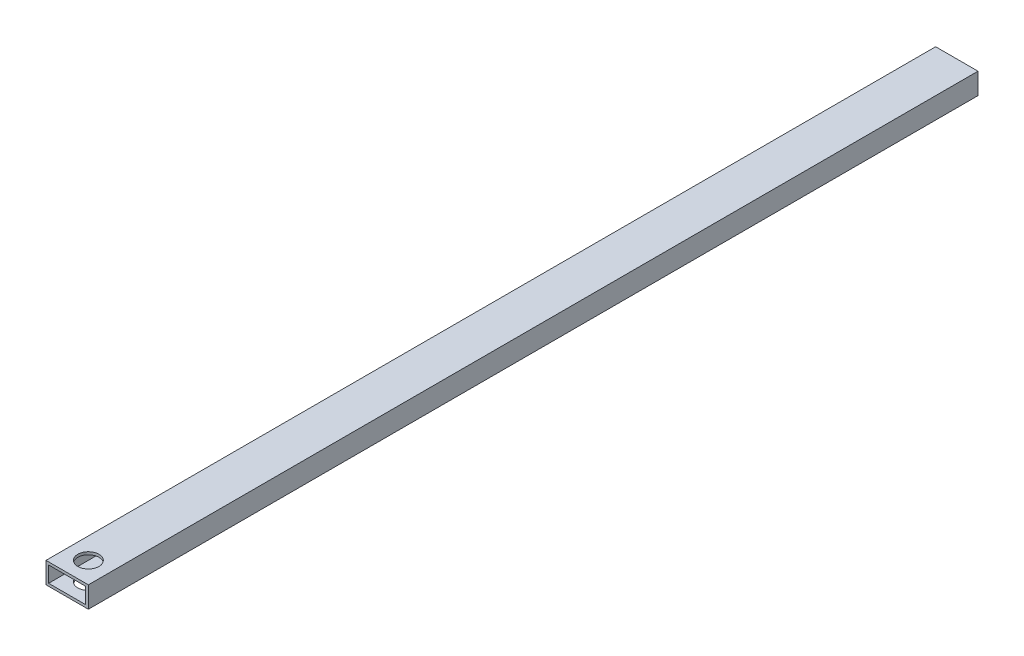
ISO-10303-21;
HEADER;
FILE_DESCRIPTION(('STEP AP214'),'2;1');
FILE_NAME('part.step','',(''),(''),'','','');
FILE_SCHEMA(('AUTOMOTIVE_DESIGN { 1 0 10303 214 1 1 1 1 }'));
ENDSEC;
DATA;
#1=APPLICATION_CONTEXT('core data for automotive mechanical design processes');
#2=APPLICATION_PROTOCOL_DEFINITION('international standard','automotive_design',2000,#1);
#3=PRODUCT_CONTEXT('',#1,'mechanical');
#4=PRODUCT('Part','Part','',(#3));
#5=PRODUCT_RELATED_PRODUCT_CATEGORY('part','',(#4));
#6=PRODUCT_DEFINITION_FORMATION('','',#4);
#7=PRODUCT_DEFINITION_CONTEXT('part definition',#1,'design');
#8=PRODUCT_DEFINITION('design','',#6,#7);
#9=PRODUCT_DEFINITION_SHAPE('','',#8);
#10=(LENGTH_UNIT() NAMED_UNIT(*) SI_UNIT(.MILLI.,.METRE.));
#11=(NAMED_UNIT(*) PLANE_ANGLE_UNIT() SI_UNIT($,.RADIAN.));
#12=(NAMED_UNIT(*) SI_UNIT($,.STERADIAN.) SOLID_ANGLE_UNIT());
#13=UNCERTAINTY_MEASURE_WITH_UNIT(LENGTH_MEASURE(1.E-05),#10,'distance_accuracy_value','');
#14=(GEOMETRIC_REPRESENTATION_CONTEXT(3) GLOBAL_UNCERTAINTY_ASSIGNED_CONTEXT((#13)) GLOBAL_UNIT_ASSIGNED_CONTEXT((#10,
#11,#12)) REPRESENTATION_CONTEXT('',''));
#15=CARTESIAN_POINT('',(0.,0.,0.));
#16=DIRECTION('',(0.,0.,1.));
#17=DIRECTION('',(1.,0.,0.));
#18=AXIS2_PLACEMENT_3D('',#15,#16,#17);
#19=CARTESIAN_POINT('',(0.,0.,1066.8));
#20=DIRECTION('',(1.,0.,0.));
#21=DIRECTION('',(0.,0.,-1.));
#22=AXIS2_PLACEMENT_3D('',#19,#20,#21);
#23=PLANE('',#22);
#24=DIRECTION('',(0.,-1.,0.));
#25=VECTOR('',#24,1.);
#26=CARTESIAN_POINT('',(0.,0.,0.));
#27=LINE('',#26,#25);
#28=CARTESIAN_POINT('',(0.,25.4,0.));
#29=VERTEX_POINT('',#28);
#30=CARTESIAN_POINT('',(0.,0.,0.));
#31=VERTEX_POINT('',#30);
#32=EDGE_CURVE('E155',#29,#31,#27,.T.);
#33=ORIENTED_EDGE('',*,*,#32,.T.);
#34=DIRECTION('',(0.,0.,-1.));
#35=VECTOR('',#34,1.);
#36=CARTESIAN_POINT('',(0.,0.,1066.8));
#37=LINE('',#36,#35);
#38=CARTESIAN_POINT('',(0.,0.,1066.8));
#39=VERTEX_POINT('',#38);
#40=EDGE_CURVE('E11',#39,#31,#37,.T.);
#41=ORIENTED_EDGE('',*,*,#40,.F.);
#42=DIRECTION('',(0.,-1.,0.));
#43=VECTOR('',#42,1.);
#44=CARTESIAN_POINT('',(0.,0.,1066.8));
#45=LINE('',#44,#43);
#46=CARTESIAN_POINT('',(0.,25.4,1066.8));
#47=VERTEX_POINT('',#46);
#48=EDGE_CURVE('E161',#47,#39,#45,.T.);
#49=ORIENTED_EDGE('',*,*,#48,.F.);
#50=DIRECTION('',(0.,0.,-1.));
#51=VECTOR('',#50,1.);
#52=CARTESIAN_POINT('',(0.,25.4,1066.8));
#53=LINE('',#52,#51);
#54=EDGE_CURVE('E175',#47,#29,#53,.T.);
#55=ORIENTED_EDGE('',*,*,#54,.T.);
#56=EDGE_LOOP('',(#33,#41,#49,#55));
#57=FACE_BOUND('',#56,.T.);
#58=ADVANCED_FACE('F43',(#57),#23,.F.);
#59=CARTESIAN_POINT('',(0.,0.,1066.8));
#60=DIRECTION('',(0.,1.,0.));
#61=DIRECTION('',(0.,0.,1.));
#62=AXIS2_PLACEMENT_3D('',#59,#60,#61);
#63=PLANE('',#62);
#64=CARTESIAN_POINT('',(25.4,0.,1041.4));
#65=DIRECTION('',(0.,1.,0.));
#66=DIRECTION('',(0.,0.,1.));
#67=AXIS2_PLACEMENT_3D('',#64,#65,#66);
#68=CIRCLE('',#67,12.7);
#69=CARTESIAN_POINT('',(25.4,0.,1054.1));
#70=VERTEX_POINT('',#69);
#71=EDGE_CURVE('E262',#70,#70,#68,.T.);
#72=ORIENTED_EDGE('',*,*,#71,.T.);
#73=EDGE_LOOP('',(#72));
#74=FACE_BOUND('',#73,.T.);
#75=DIRECTION('',(1.,0.,0.));
#76=VECTOR('',#75,1.);
#77=CARTESIAN_POINT('',(0.,0.,0.));
#78=LINE('',#77,#76);
#79=CARTESIAN_POINT('',(50.8,0.,0.));
#80=VERTEX_POINT('',#79);
#81=EDGE_CURVE('E179',#31,#80,#78,.T.);
#82=ORIENTED_EDGE('',*,*,#81,.T.);
#83=DIRECTION('',(0.,0.,-1.));
#84=VECTOR('',#83,1.);
#85=CARTESIAN_POINT('',(50.8,0.,1066.8));
#86=LINE('',#85,#84);
#87=CARTESIAN_POINT('',(50.8,0.,1066.8));
#88=VERTEX_POINT('',#87);
#89=EDGE_CURVE('E52',#88,#80,#86,.T.);
#90=ORIENTED_EDGE('',*,*,#89,.F.);
#91=DIRECTION('',(1.,0.,0.));
#92=VECTOR('',#91,1.);
#93=CARTESIAN_POINT('',(0.,0.,1066.8));
#94=LINE('',#93,#92);
#95=EDGE_CURVE('E165',#39,#88,#94,.T.);
#96=ORIENTED_EDGE('',*,*,#95,.F.);
#97=ORIENTED_EDGE('',*,*,#40,.T.);
#98=EDGE_LOOP('',(#82,#90,#96,#97));
#99=FACE_BOUND('',#98,.T.);
#100=ADVANCED_FACE('F214',(#74,#99),#63,.F.);
#101=CARTESIAN_POINT('',(50.8,0.,1066.8));
#102=DIRECTION('',(-1.,0.,0.));
#103=DIRECTION('',(0.,0.,1.));
#104=AXIS2_PLACEMENT_3D('',#101,#102,#103);
#105=PLANE('',#104);
#106=DIRECTION('',(0.,1.,0.));
#107=VECTOR('',#106,1.);
#108=CARTESIAN_POINT('',(50.8,0.,0.));
#109=LINE('',#108,#107);
#110=CARTESIAN_POINT('',(50.8,25.4,0.));
#111=VERTEX_POINT('',#110);
#112=EDGE_CURVE('E182',#80,#111,#109,.T.);
#113=ORIENTED_EDGE('',*,*,#112,.T.);
#114=DIRECTION('',(0.,0.,-1.));
#115=VECTOR('',#114,1.);
#116=CARTESIAN_POINT('',(50.8,25.4,1066.8));
#117=LINE('',#116,#115);
#118=CARTESIAN_POINT('',(50.8,25.4,1066.8));
#119=VERTEX_POINT('',#118);
#120=EDGE_CURVE('E190',#119,#111,#117,.T.);
#121=ORIENTED_EDGE('',*,*,#120,.F.);
#122=DIRECTION('',(0.,1.,0.));
#123=VECTOR('',#122,1.);
#124=CARTESIAN_POINT('',(50.8,0.,1066.8));
#125=LINE('',#124,#123);
#126=EDGE_CURVE('E169',#88,#119,#125,.T.);
#127=ORIENTED_EDGE('',*,*,#126,.F.);
#128=ORIENTED_EDGE('',*,*,#89,.T.);
#129=EDGE_LOOP('',(#113,#121,#127,#128));
#130=FACE_BOUND('',#129,.T.);
#131=ADVANCED_FACE('F200',(#130),#105,.F.);
#132=CARTESIAN_POINT('',(0.,25.4,1066.8));
#133=DIRECTION('',(0.,-1.,0.));
#134=DIRECTION('',(0.,0.,-1.));
#135=AXIS2_PLACEMENT_3D('',#132,#133,#134);
#136=PLANE('',#135);
#137=CARTESIAN_POINT('',(25.4,25.4,1041.4));
#138=DIRECTION('',(0.,-1.,0.));
#139=DIRECTION('',(0.,0.,-1.));
#140=AXIS2_PLACEMENT_3D('',#137,#138,#139);
#141=CIRCLE('',#140,12.7);
#142=CARTESIAN_POINT('',(25.4,25.4,1028.7));
#143=VERTEX_POINT('',#142);
#144=EDGE_CURVE('E137',#143,#143,#141,.T.);
#145=ORIENTED_EDGE('',*,*,#144,.T.);
#146=EDGE_LOOP('',(#145));
#147=FACE_BOUND('',#146,.T.);
#148=DIRECTION('',(-1.,0.,0.));
#149=VECTOR('',#148,1.);
#150=CARTESIAN_POINT('',(0.,25.4,0.));
#151=LINE('',#150,#149);
#152=EDGE_CURVE('E166',#111,#29,#151,.T.);
#153=ORIENTED_EDGE('',*,*,#152,.T.);
#154=ORIENTED_EDGE('',*,*,#54,.F.);
#155=DIRECTION('',(-1.,0.,0.));
#156=VECTOR('',#155,1.);
#157=CARTESIAN_POINT('',(0.,25.4,1066.8));
#158=LINE('',#157,#156);
#159=EDGE_CURVE('E172',#119,#47,#158,.T.);
#160=ORIENTED_EDGE('',*,*,#159,.F.);
#161=ORIENTED_EDGE('',*,*,#120,.T.);
#162=EDGE_LOOP('',(#153,#154,#160,#161));
#163=FACE_BOUND('',#162,.T.);
#164=ADVANCED_FACE('F207',(#147,#163),#136,.F.);
#165=CARTESIAN_POINT('',(0.,0.,1066.8));
#166=DIRECTION('',(0.,0.,-1.));
#167=DIRECTION('',(-1.,0.,0.));
#168=AXIS2_PLACEMENT_3D('',#165,#166,#167);
#169=PLANE('',#168);
#170=DIRECTION('',(1.,0.,0.));
#171=VECTOR('',#170,1.);
#172=CARTESIAN_POINT('',(3.175,3.175,1066.8));
#173=LINE('',#172,#171);
#174=CARTESIAN_POINT('',(3.175,3.175,1066.8));
#175=VERTEX_POINT('',#174);
#176=CARTESIAN_POINT('',(47.625,3.175,1066.8));
#177=VERTEX_POINT('',#176);
#178=EDGE_CURVE('E146',#175,#177,#173,.T.);
#179=ORIENTED_EDGE('',*,*,#178,.F.);
#180=DIRECTION('',(0.,-1.,0.));
#181=VECTOR('',#180,1.);
#182=CARTESIAN_POINT('',(3.175,22.225,1066.8));
#183=LINE('',#182,#181);
#184=CARTESIAN_POINT('',(3.175,22.225,1066.8));
#185=VERTEX_POINT('',#184);
#186=EDGE_CURVE('E59',#185,#175,#183,.T.);
#187=ORIENTED_EDGE('',*,*,#186,.F.);
#188=DIRECTION('',(-1.,0.,0.));
#189=VECTOR('',#188,1.);
#190=CARTESIAN_POINT('',(3.175,22.225,1066.8));
#191=LINE('',#190,#189);
#192=CARTESIAN_POINT('',(47.625,22.225,1066.8));
#193=VERTEX_POINT('',#192);
#194=EDGE_CURVE('E130',#193,#185,#191,.T.);
#195=ORIENTED_EDGE('',*,*,#194,.F.);
#196=DIRECTION('',(0.,1.,0.));
#197=VECTOR('',#196,1.);
#198=CARTESIAN_POINT('',(47.625,22.225,1066.8));
#199=LINE('',#198,#197);
#200=EDGE_CURVE('E134',#177,#193,#199,.T.);
#201=ORIENTED_EDGE('',*,*,#200,.F.);
#202=EDGE_LOOP('',(#179,#187,#195,#201));
#203=FACE_BOUND('',#202,.T.);
#204=ORIENTED_EDGE('',*,*,#48,.T.);
#205=ORIENTED_EDGE('',*,*,#95,.T.);
#206=ORIENTED_EDGE('',*,*,#126,.T.);
#207=ORIENTED_EDGE('',*,*,#159,.T.);
#208=EDGE_LOOP('',(#204,#205,#206,#207));
#209=FACE_BOUND('',#208,.T.);
#210=ADVANCED_FACE('F213',(#203,#209),#169,.F.);
#211=CARTESIAN_POINT('',(0.,0.,0.));
#212=DIRECTION('',(0.,0.,-1.));
#213=DIRECTION('',(-1.,0.,0.));
#214=AXIS2_PLACEMENT_3D('',#211,#212,#213);
#215=PLANE('',#214);
#216=DIRECTION('',(0.,-1.,0.));
#217=VECTOR('',#216,1.);
#218=CARTESIAN_POINT('',(3.175,22.225,0.));
#219=LINE('',#218,#217);
#220=CARTESIAN_POINT('',(3.175,22.225,0.));
#221=VERTEX_POINT('',#220);
#222=CARTESIAN_POINT('',(3.175,3.175,0.));
#223=VERTEX_POINT('',#222);
#224=EDGE_CURVE('E111',#221,#223,#219,.T.);
#225=ORIENTED_EDGE('',*,*,#224,.T.);
#226=DIRECTION('',(1.,0.,0.));
#227=VECTOR('',#226,1.);
#228=CARTESIAN_POINT('',(3.175,3.175,0.));
#229=LINE('',#228,#227);
#230=CARTESIAN_POINT('',(47.625,3.175,0.));
#231=VERTEX_POINT('',#230);
#232=EDGE_CURVE('E121',#223,#231,#229,.T.);
#233=ORIENTED_EDGE('',*,*,#232,.T.);
#234=DIRECTION('',(0.,1.,0.));
#235=VECTOR('',#234,1.);
#236=CARTESIAN_POINT('',(47.625,22.225,0.));
#237=LINE('',#236,#235);
#238=CARTESIAN_POINT('',(47.625,22.225,0.));
#239=VERTEX_POINT('',#238);
#240=EDGE_CURVE('E67',#231,#239,#237,.T.);
#241=ORIENTED_EDGE('',*,*,#240,.T.);
#242=DIRECTION('',(-1.,0.,0.));
#243=VECTOR('',#242,1.);
#244=CARTESIAN_POINT('',(3.175,22.225,0.));
#245=LINE('',#244,#243);
#246=EDGE_CURVE('E118',#239,#221,#245,.T.);
#247=ORIENTED_EDGE('',*,*,#246,.T.);
#248=EDGE_LOOP('',(#225,#233,#241,#247));
#249=FACE_BOUND('',#248,.T.);
#250=ORIENTED_EDGE('',*,*,#32,.F.);
#251=ORIENTED_EDGE('',*,*,#152,.F.);
#252=ORIENTED_EDGE('',*,*,#112,.F.);
#253=ORIENTED_EDGE('',*,*,#81,.F.);
#254=EDGE_LOOP('',(#250,#251,#252,#253));
#255=FACE_BOUND('',#254,.T.);
#256=ADVANCED_FACE('F126',(#249,#255),#215,.T.);
#257=CARTESIAN_POINT('',(3.175,22.225,0.));
#258=DIRECTION('',(-1.,0.,0.));
#259=DIRECTION('',(0.,-1.,0.));
#260=AXIS2_PLACEMENT_3D('',#257,#258,#259);
#261=PLANE('',#260);
#262=ORIENTED_EDGE('',*,*,#186,.T.);
#263=DIRECTION('',(0.,0.,1.));
#264=VECTOR('',#263,1.);
#265=CARTESIAN_POINT('',(3.175,3.175,0.));
#266=LINE('',#265,#264);
#267=EDGE_CURVE('E107',#223,#175,#266,.T.);
#268=ORIENTED_EDGE('',*,*,#267,.F.);
#269=ORIENTED_EDGE('',*,*,#224,.F.);
#270=DIRECTION('',(0.,0.,1.));
#271=VECTOR('',#270,1.);
#272=CARTESIAN_POINT('',(3.175,22.225,0.));
#273=LINE('',#272,#271);
#274=EDGE_CURVE('E152',#221,#185,#273,.T.);
#275=ORIENTED_EDGE('',*,*,#274,.T.);
#276=EDGE_LOOP('',(#262,#268,#269,#275));
#277=FACE_BOUND('',#276,.T.);
#278=ADVANCED_FACE('F109',(#277),#261,.F.);
#279=CARTESIAN_POINT('',(3.175,22.225,0.));
#280=DIRECTION('',(0.,1.,0.));
#281=DIRECTION('',(0.,0.,1.));
#282=AXIS2_PLACEMENT_3D('',#279,#280,#281);
#283=PLANE('',#282);
#284=CARTESIAN_POINT('',(25.4,22.225,1041.4));
#285=DIRECTION('',(0.,1.,0.));
#286=DIRECTION('',(0.,0.,1.));
#287=AXIS2_PLACEMENT_3D('',#284,#285,#286);
#288=CIRCLE('',#287,12.7);
#289=CARTESIAN_POINT('',(25.4,22.225,1054.1));
#290=VERTEX_POINT('',#289);
#291=EDGE_CURVE('E255',#290,#290,#288,.T.);
#292=ORIENTED_EDGE('',*,*,#291,.T.);
#293=EDGE_LOOP('',(#292));
#294=FACE_BOUND('',#293,.T.);
#295=ORIENTED_EDGE('',*,*,#194,.T.);
#296=ORIENTED_EDGE('',*,*,#274,.F.);
#297=ORIENTED_EDGE('',*,*,#246,.F.);
#298=DIRECTION('',(0.,0.,1.));
#299=VECTOR('',#298,1.);
#300=CARTESIAN_POINT('',(47.625,22.225,0.));
#301=LINE('',#300,#299);
#302=EDGE_CURVE('E156',#239,#193,#301,.T.);
#303=ORIENTED_EDGE('',*,*,#302,.T.);
#304=EDGE_LOOP('',(#295,#296,#297,#303));
#305=FACE_BOUND('',#304,.T.);
#306=ADVANCED_FACE('F234',(#294,#305),#283,.F.);
#307=CARTESIAN_POINT('',(47.625,22.225,0.));
#308=DIRECTION('',(1.,0.,0.));
#309=DIRECTION('',(0.,0.,-1.));
#310=AXIS2_PLACEMENT_3D('',#307,#308,#309);
#311=PLANE('',#310);
#312=ORIENTED_EDGE('',*,*,#200,.T.);
#313=ORIENTED_EDGE('',*,*,#302,.F.);
#314=ORIENTED_EDGE('',*,*,#240,.F.);
#315=DIRECTION('',(0.,0.,1.));
#316=VECTOR('',#315,1.);
#317=CARTESIAN_POINT('',(47.625,3.175,0.));
#318=LINE('',#317,#316);
#319=EDGE_CURVE('E117',#231,#177,#318,.T.);
#320=ORIENTED_EDGE('',*,*,#319,.T.);
#321=EDGE_LOOP('',(#312,#313,#314,#320));
#322=FACE_BOUND('',#321,.T.);
#323=ADVANCED_FACE('F238',(#322),#311,.F.);
#324=CARTESIAN_POINT('',(3.175,3.175,0.));
#325=DIRECTION('',(0.,-1.,0.));
#326=DIRECTION('',(0.,0.,-1.));
#327=AXIS2_PLACEMENT_3D('',#324,#325,#326);
#328=PLANE('',#327);
#329=CARTESIAN_POINT('',(25.4,3.175,1041.4));
#330=DIRECTION('',(0.,-1.,0.));
#331=DIRECTION('',(0.,0.,-1.));
#332=AXIS2_PLACEMENT_3D('',#329,#330,#331);
#333=CIRCLE('',#332,12.7);
#334=CARTESIAN_POINT('',(25.4,3.175,1028.7));
#335=VERTEX_POINT('',#334);
#336=EDGE_CURVE('E46',#335,#335,#333,.T.);
#337=ORIENTED_EDGE('',*,*,#336,.T.);
#338=EDGE_LOOP('',(#337));
#339=FACE_BOUND('',#338,.T.);
#340=ORIENTED_EDGE('',*,*,#178,.T.);
#341=ORIENTED_EDGE('',*,*,#319,.F.);
#342=ORIENTED_EDGE('',*,*,#232,.F.);
#343=ORIENTED_EDGE('',*,*,#267,.T.);
#344=EDGE_LOOP('',(#340,#341,#342,#343));
#345=FACE_BOUND('',#344,.T.);
#346=ADVANCED_FACE('F122',(#339,#345),#328,.F.);
#347=CARTESIAN_POINT('',(25.4,0.,1041.4));
#348=DIRECTION('',(0.,1.,0.));
#349=DIRECTION('',(0.,0.,1.));
#350=AXIS2_PLACEMENT_3D('',#347,#348,#349);
#351=CYLINDRICAL_SURFACE('',#350,12.7);
#352=ORIENTED_EDGE('',*,*,#71,.F.);
#353=EDGE_LOOP('',(#352));
#354=FACE_BOUND('',#353,.T.);
#355=ORIENTED_EDGE('',*,*,#336,.F.);
#356=EDGE_LOOP('',(#355));
#357=FACE_BOUND('',#356,.T.);
#358=ADVANCED_FACE('F237',(#354,#357),#351,.F.);
#359=ORIENTED_EDGE('',*,*,#291,.F.);
#360=EDGE_LOOP('',(#359));
#361=FACE_BOUND('',#360,.T.);
#362=ORIENTED_EDGE('',*,*,#144,.F.);
#363=EDGE_LOOP('',(#362));
#364=FACE_BOUND('',#363,.T.);
#365=ADVANCED_FACE('F245',(#361,#364),#351,.F.);
#366=CLOSED_SHELL('',(#58,#100,#131,#164,#210,#256,#278,#306,#323,#346,#358,#365));
#367=MANIFOLD_SOLID_BREP('B2',#366);
#368=ADVANCED_BREP_SHAPE_REPRESENTATION('',(#18,#367),#14);
#369=SHAPE_DEFINITION_REPRESENTATION(#9,#368);
ENDSEC;
END-ISO-10303-21;
